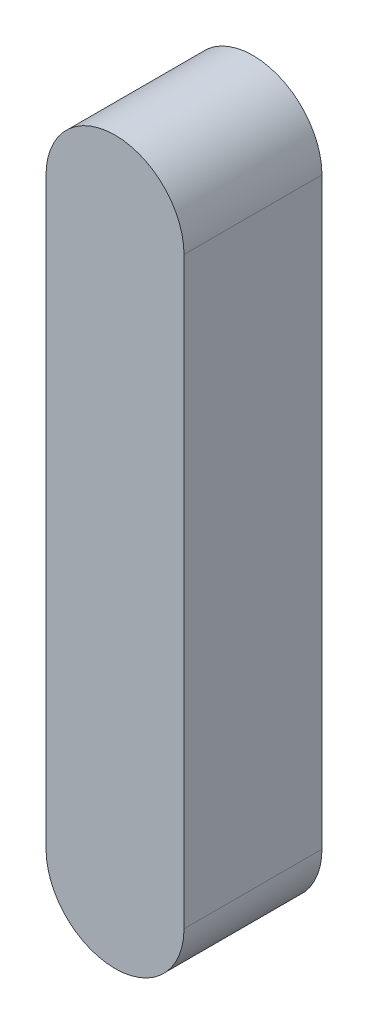
ISO-10303-21;
HEADER;
FILE_DESCRIPTION(('STEP AP214'),'2;1');
FILE_NAME('part.step','',(''),(''),'','','');
FILE_SCHEMA(('AUTOMOTIVE_DESIGN { 1 0 10303 214 1 1 1 1 }'));
ENDSEC;
DATA;
#1=APPLICATION_CONTEXT('core data for automotive mechanical design processes');
#2=APPLICATION_PROTOCOL_DEFINITION('international standard','automotive_design',2000,#1);
#3=PRODUCT_CONTEXT('',#1,'mechanical');
#4=PRODUCT('Part','Part','',(#3));
#5=PRODUCT_RELATED_PRODUCT_CATEGORY('part','',(#4));
#6=PRODUCT_DEFINITION_FORMATION('','',#4);
#7=PRODUCT_DEFINITION_CONTEXT('part definition',#1,'design');
#8=PRODUCT_DEFINITION('design','',#6,#7);
#9=PRODUCT_DEFINITION_SHAPE('','',#8);
#10=(LENGTH_UNIT() NAMED_UNIT(*) SI_UNIT(.MILLI.,.METRE.));
#11=(NAMED_UNIT(*) PLANE_ANGLE_UNIT() SI_UNIT($,.RADIAN.));
#12=(NAMED_UNIT(*) SI_UNIT($,.STERADIAN.) SOLID_ANGLE_UNIT());
#13=UNCERTAINTY_MEASURE_WITH_UNIT(LENGTH_MEASURE(1.E-05),#10,'distance_accuracy_value','');
#14=(GEOMETRIC_REPRESENTATION_CONTEXT(3) GLOBAL_UNCERTAINTY_ASSIGNED_CONTEXT((#13)) GLOBAL_UNIT_ASSIGNED_CONTEXT((#10,
#11,#12)) REPRESENTATION_CONTEXT('',''));
#15=CARTESIAN_POINT('',(0.,0.,0.));
#16=DIRECTION('',(0.,0.,1.));
#17=DIRECTION('',(1.,0.,0.));
#18=AXIS2_PLACEMENT_3D('',#15,#16,#17);
#19=CARTESIAN_POINT('',(1.5,14.2,3.));
#20=DIRECTION('',(1.,0.,0.));
#21=DIRECTION('',(0.,0.,-1.));
#22=AXIS2_PLACEMENT_3D('',#19,#20,#21);
#23=PLANE('',#22);
#24=DIRECTION('',(0.,-1.,0.));
#25=VECTOR('',#24,1.);
#26=CARTESIAN_POINT('',(1.5,14.2,0.));
#27=LINE('',#26,#25);
#28=CARTESIAN_POINT('',(1.5,14.2,0.));
#29=VERTEX_POINT('',#28);
#30=CARTESIAN_POINT('',(1.5,1.5,0.));
#31=VERTEX_POINT('',#30);
#32=EDGE_CURVE('E89',#29,#31,#27,.T.);
#33=ORIENTED_EDGE('',*,*,#32,.F.);
#34=DIRECTION('',(0.,0.,-1.));
#35=VECTOR('',#34,1.);
#36=CARTESIAN_POINT('',(1.5,14.2,3.));
#37=LINE('',#36,#35);
#38=CARTESIAN_POINT('',(1.5,14.2,3.));
#39=VERTEX_POINT('',#38);
#40=EDGE_CURVE('E20',#39,#29,#37,.T.);
#41=ORIENTED_EDGE('',*,*,#40,.F.);
#42=DIRECTION('',(0.,-1.,0.));
#43=VECTOR('',#42,1.);
#44=CARTESIAN_POINT('',(1.5,14.2,3.));
#45=LINE('',#44,#43);
#46=CARTESIAN_POINT('',(1.5,1.5,3.));
#47=VERTEX_POINT('',#46);
#48=EDGE_CURVE('E73',#39,#47,#45,.T.);
#49=ORIENTED_EDGE('',*,*,#48,.T.);
#50=DIRECTION('',(0.,0.,-1.));
#51=VECTOR('',#50,1.);
#52=CARTESIAN_POINT('',(1.5,1.5,3.));
#53=LINE('',#52,#51);
#54=EDGE_CURVE('E11',#47,#31,#53,.T.);
#55=ORIENTED_EDGE('',*,*,#54,.T.);
#56=EDGE_LOOP('',(#33,#41,#49,#55));
#57=FACE_BOUND('',#56,.T.);
#58=ADVANCED_FACE('F17',(#57),#23,.T.);
#59=CARTESIAN_POINT('',(0.,1.5,3.));
#60=DIRECTION('',(0.,0.,-1.));
#61=DIRECTION('',(-1.,0.,0.));
#62=AXIS2_PLACEMENT_3D('',#59,#60,#61);
#63=CYLINDRICAL_SURFACE('',#62,1.5);
#64=CARTESIAN_POINT('',(0.,1.5,0.));
#65=DIRECTION('',(0.,0.,-1.));
#66=DIRECTION('',(1.,0.,0.));
#67=AXIS2_PLACEMENT_3D('',#64,#65,#66);
#68=CIRCLE('',#67,1.5);
#69=CARTESIAN_POINT('',(-1.5,1.5,0.));
#70=VERTEX_POINT('',#69);
#71=EDGE_CURVE('E64',#31,#70,#68,.T.);
#72=ORIENTED_EDGE('',*,*,#71,.F.);
#73=ORIENTED_EDGE('',*,*,#54,.F.);
#74=CARTESIAN_POINT('',(0.,1.5,3.));
#75=DIRECTION('',(0.,0.,-1.));
#76=DIRECTION('',(1.,0.,0.));
#77=AXIS2_PLACEMENT_3D('',#74,#75,#76);
#78=CIRCLE('',#77,1.5);
#79=CARTESIAN_POINT('',(-1.5,1.5,3.));
#80=VERTEX_POINT('',#79);
#81=EDGE_CURVE('E62',#47,#80,#78,.T.);
#82=ORIENTED_EDGE('',*,*,#81,.T.);
#83=DIRECTION('',(0.,0.,-1.));
#84=VECTOR('',#83,1.);
#85=CARTESIAN_POINT('',(-1.5,1.5,3.));
#86=LINE('',#85,#84);
#87=EDGE_CURVE('E27',#80,#70,#86,.T.);
#88=ORIENTED_EDGE('',*,*,#87,.T.);
#89=EDGE_LOOP('',(#72,#73,#82,#88));
#90=FACE_BOUND('',#89,.T.);
#91=ADVANCED_FACE('F61',(#90),#63,.T.);
#92=CARTESIAN_POINT('',(-1.5,1.5,3.));
#93=DIRECTION('',(-1.,0.,0.));
#94=DIRECTION('',(0.,0.,1.));
#95=AXIS2_PLACEMENT_3D('',#92,#93,#94);
#96=PLANE('',#95);
#97=DIRECTION('',(0.,1.,0.));
#98=VECTOR('',#97,1.);
#99=CARTESIAN_POINT('',(-1.5,1.5,0.));
#100=LINE('',#99,#98);
#101=CARTESIAN_POINT('',(-1.5,14.2,0.));
#102=VERTEX_POINT('',#101);
#103=EDGE_CURVE('E83',#70,#102,#100,.T.);
#104=ORIENTED_EDGE('',*,*,#103,.F.);
#105=ORIENTED_EDGE('',*,*,#87,.F.);
#106=DIRECTION('',(0.,1.,0.));
#107=VECTOR('',#106,1.);
#108=CARTESIAN_POINT('',(-1.5,1.5,3.));
#109=LINE('',#108,#107);
#110=CARTESIAN_POINT('',(-1.5,14.2,3.));
#111=VERTEX_POINT('',#110);
#112=EDGE_CURVE('E74',#80,#111,#109,.T.);
#113=ORIENTED_EDGE('',*,*,#112,.T.);
#114=DIRECTION('',(0.,0.,-1.));
#115=VECTOR('',#114,1.);
#116=CARTESIAN_POINT('',(-1.5,14.2,3.));
#117=LINE('',#116,#115);
#118=EDGE_CURVE('E35',#111,#102,#117,.T.);
#119=ORIENTED_EDGE('',*,*,#118,.T.);
#120=EDGE_LOOP('',(#104,#105,#113,#119));
#121=FACE_BOUND('',#120,.T.);
#122=ADVANCED_FACE('F132',(#121),#96,.T.);
#123=CARTESIAN_POINT('',(0.,14.2,3.));
#124=DIRECTION('',(0.,0.,-1.));
#125=DIRECTION('',(-1.,0.,0.));
#126=AXIS2_PLACEMENT_3D('',#123,#124,#125);
#127=CYLINDRICAL_SURFACE('',#126,1.5);
#128=CARTESIAN_POINT('',(0.,14.2,0.));
#129=DIRECTION('',(0.,0.,-1.));
#130=DIRECTION('',(1.,0.,0.));
#131=AXIS2_PLACEMENT_3D('',#128,#129,#130);
#132=CIRCLE('',#131,1.5);
#133=EDGE_CURVE('E54',#102,#29,#132,.T.);
#134=ORIENTED_EDGE('',*,*,#133,.F.);
#135=ORIENTED_EDGE('',*,*,#118,.F.);
#136=CARTESIAN_POINT('',(0.,14.2,3.));
#137=DIRECTION('',(0.,0.,-1.));
#138=DIRECTION('',(1.,0.,0.));
#139=AXIS2_PLACEMENT_3D('',#136,#137,#138);
#140=CIRCLE('',#139,1.5);
#141=EDGE_CURVE('E57',#111,#39,#140,.T.);
#142=ORIENTED_EDGE('',*,*,#141,.T.);
#143=ORIENTED_EDGE('',*,*,#40,.T.);
#144=EDGE_LOOP('',(#134,#135,#142,#143));
#145=FACE_BOUND('',#144,.T.);
#146=ADVANCED_FACE('F126',(#145),#127,.T.);
#147=CARTESIAN_POINT('',(0.,1.5,3.));
#148=DIRECTION('',(0.,0.,-1.));
#149=DIRECTION('',(-1.,0.,0.));
#150=AXIS2_PLACEMENT_3D('',#147,#148,#149);
#151=PLANE('',#150);
#152=ORIENTED_EDGE('',*,*,#48,.F.);
#153=ORIENTED_EDGE('',*,*,#141,.F.);
#154=ORIENTED_EDGE('',*,*,#112,.F.);
#155=ORIENTED_EDGE('',*,*,#81,.F.);
#156=EDGE_LOOP('',(#152,#153,#154,#155));
#157=FACE_BOUND('',#156,.T.);
#158=ADVANCED_FACE('F72',(#157),#151,.F.);
#159=CARTESIAN_POINT('',(0.,1.5,0.));
#160=DIRECTION('',(0.,0.,-1.));
#161=DIRECTION('',(-1.,0.,0.));
#162=AXIS2_PLACEMENT_3D('',#159,#160,#161);
#163=PLANE('',#162);
#164=ORIENTED_EDGE('',*,*,#32,.T.);
#165=ORIENTED_EDGE('',*,*,#71,.T.);
#166=ORIENTED_EDGE('',*,*,#103,.T.);
#167=ORIENTED_EDGE('',*,*,#133,.T.);
#168=EDGE_LOOP('',(#164,#165,#166,#167));
#169=FACE_BOUND('',#168,.T.);
#170=ADVANCED_FACE('F125',(#169),#163,.T.);
#171=CLOSED_SHELL('',(#58,#91,#122,#146,#158,#170));
#172=MANIFOLD_SOLID_BREP('B1',#171);
#173=ADVANCED_BREP_SHAPE_REPRESENTATION('',(#18,#172),#14);
#174=SHAPE_DEFINITION_REPRESENTATION(#9,#173);
ENDSEC;
END-ISO-10303-21;
